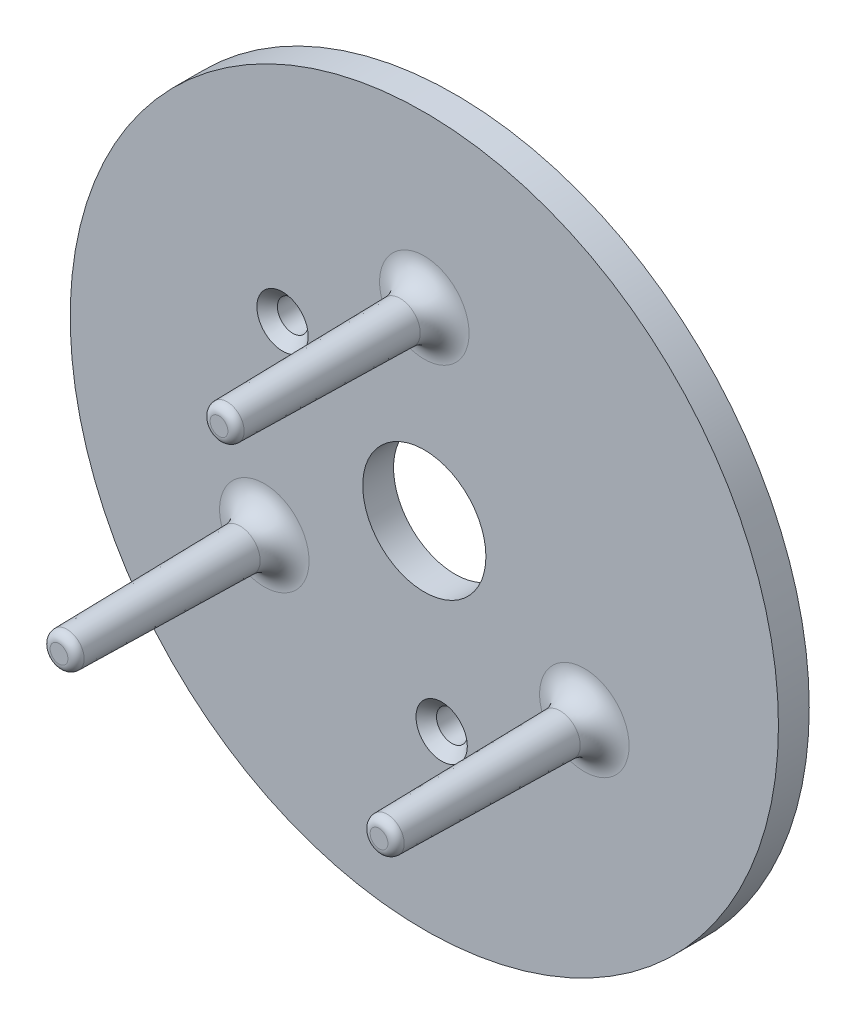
ISO-10303-21;
HEADER;
FILE_DESCRIPTION(('STEP AP214'),'2;1');
FILE_NAME('part.step','',(''),(''),'','','');
FILE_SCHEMA(('AUTOMOTIVE_DESIGN { 1 0 10303 214 1 1 1 1 }'));
ENDSEC;
DATA;
#1=APPLICATION_CONTEXT('core data for automotive mechanical design processes');
#2=APPLICATION_PROTOCOL_DEFINITION('international standard','automotive_design',2000,#1);
#3=PRODUCT_CONTEXT('',#1,'mechanical');
#4=PRODUCT('Part','Part','',(#3));
#5=PRODUCT_RELATED_PRODUCT_CATEGORY('part','',(#4));
#6=PRODUCT_DEFINITION_FORMATION('','',#4);
#7=PRODUCT_DEFINITION_CONTEXT('part definition',#1,'design');
#8=PRODUCT_DEFINITION('design','',#6,#7);
#9=PRODUCT_DEFINITION_SHAPE('','',#8);
#10=(LENGTH_UNIT() NAMED_UNIT(*) SI_UNIT(.MILLI.,.METRE.));
#11=(NAMED_UNIT(*) PLANE_ANGLE_UNIT() SI_UNIT($,.RADIAN.));
#12=(NAMED_UNIT(*) SI_UNIT($,.STERADIAN.) SOLID_ANGLE_UNIT());
#13=UNCERTAINTY_MEASURE_WITH_UNIT(LENGTH_MEASURE(1.E-05),#10,'distance_accuracy_value','');
#14=(GEOMETRIC_REPRESENTATION_CONTEXT(3) GLOBAL_UNCERTAINTY_ASSIGNED_CONTEXT((#13)) GLOBAL_UNIT_ASSIGNED_CONTEXT((#10,
#11,#12)) REPRESENTATION_CONTEXT('',''));
#15=CARTESIAN_POINT('',(0.,0.,0.));
#16=DIRECTION('',(0.,0.,1.));
#17=DIRECTION('',(1.,0.,0.));
#18=AXIS2_PLACEMENT_3D('',#15,#16,#17);
#19=CARTESIAN_POINT('',(0.,0.,3.));
#20=DIRECTION('',(0.,0.,-1.));
#21=DIRECTION('',(-1.,0.,0.));
#22=AXIS2_PLACEMENT_3D('',#19,#20,#21);
#23=CYLINDRICAL_SURFACE('',#22,6.);
#24=CARTESIAN_POINT('',(0.,0.,3.));
#25=DIRECTION('',(0.,0.,1.));
#26=DIRECTION('',(1.,0.,0.));
#27=AXIS2_PLACEMENT_3D('',#24,#25,#26);
#28=CIRCLE('',#27,6.);
#29=CARTESIAN_POINT('',(6.,0.,3.));
#30=VERTEX_POINT('',#29);
#31=EDGE_CURVE('E102',#30,#30,#28,.T.);
#32=ORIENTED_EDGE('',*,*,#31,.T.);
#33=EDGE_LOOP('',(#32));
#34=FACE_BOUND('',#33,.T.);
#35=CARTESIAN_POINT('',(0.,0.,0.));
#36=DIRECTION('',(0.,0.,1.));
#37=DIRECTION('',(1.,0.,0.));
#38=AXIS2_PLACEMENT_3D('',#35,#36,#37);
#39=CIRCLE('',#38,6.);
#40=CARTESIAN_POINT('',(6.,0.,0.));
#41=VERTEX_POINT('',#40);
#42=EDGE_CURVE('E103',#41,#41,#39,.T.);
#43=ORIENTED_EDGE('',*,*,#42,.F.);
#44=EDGE_LOOP('',(#43));
#45=FACE_BOUND('',#44,.T.);
#46=ADVANCED_FACE('F41',(#34,#45),#23,.F.);
#47=CARTESIAN_POINT('',(0.,0.,3.));
#48=DIRECTION('',(0.,0.,-1.));
#49=DIRECTION('',(-1.,0.,0.));
#50=AXIS2_PLACEMENT_3D('',#47,#48,#49);
#51=CYLINDRICAL_SURFACE('',#50,34.5);
#52=CARTESIAN_POINT('',(0.,0.,3.));
#53=DIRECTION('',(0.,0.,1.));
#54=DIRECTION('',(1.,0.,0.));
#55=AXIS2_PLACEMENT_3D('',#52,#53,#54);
#56=CIRCLE('',#55,34.5);
#57=CARTESIAN_POINT('',(34.5,0.,3.));
#58=VERTEX_POINT('',#57);
#59=EDGE_CURVE('E98',#58,#58,#56,.T.);
#60=ORIENTED_EDGE('',*,*,#59,.F.);
#61=EDGE_LOOP('',(#60));
#62=FACE_BOUND('',#61,.T.);
#63=CARTESIAN_POINT('',(0.,0.,0.));
#64=DIRECTION('',(0.,0.,1.));
#65=DIRECTION('',(1.,0.,0.));
#66=AXIS2_PLACEMENT_3D('',#63,#64,#65);
#67=CIRCLE('',#66,34.5);
#68=CARTESIAN_POINT('',(34.5,0.,0.));
#69=VERTEX_POINT('',#68);
#70=EDGE_CURVE('E99',#69,#69,#67,.T.);
#71=ORIENTED_EDGE('',*,*,#70,.T.);
#72=EDGE_LOOP('',(#71));
#73=FACE_BOUND('',#72,.T.);
#74=ADVANCED_FACE('F131',(#62,#73),#51,.T.);
#75=CARTESIAN_POINT('',(0.,0.,3.));
#76=DIRECTION('',(0.,0.,1.));
#77=DIRECTION('',(1.,0.,0.));
#78=AXIS2_PLACEMENT_3D('',#75,#76,#77);
#79=PLANE('',#78);
#80=CARTESIAN_POINT('',(1.68782217350877,-16.9233937586588,3.));
#81=DIRECTION('',(0.,0.,1.));
#82=DIRECTION('',(1.,0.,0.));
#83=AXIS2_PLACEMENT_3D('',#80,#81,#82);
#84=CIRCLE('',#83,2.50000000000006);
#85=CARTESIAN_POINT('',(4.18782217350883,-16.9233937586588,3.));
#86=VERTEX_POINT('',#85);
#87=EDGE_CURVE('E49',#86,#86,#84,.F.);
#88=ORIENTED_EDGE('',*,*,#87,.T.);
#89=EDGE_LOOP('',(#88));
#90=FACE_BOUND('',#89,.T.);
#91=CARTESIAN_POINT('',(-13.812177826491,9.92339375865892,3.));
#92=DIRECTION('',(0.,0.,1.));
#93=DIRECTION('',(1.,0.,0.));
#94=AXIS2_PLACEMENT_3D('',#91,#92,#93);
#95=CIRCLE('',#94,2.50000000000005);
#96=CARTESIAN_POINT('',(-11.3121778264909,9.92339375865892,3.));
#97=VERTEX_POINT('',#96);
#98=EDGE_CURVE('E53',#97,#97,#95,.F.);
#99=ORIENTED_EDGE('',*,*,#98,.T.);
#100=EDGE_LOOP('',(#99));
#101=FACE_BOUND('',#100,.T.);
#102=CARTESIAN_POINT('',(-15.58845726812,-8.99999999999985,3.));
#103=DIRECTION('',(0.,0.,1.));
#104=DIRECTION('',(1.,0.,0.));
#105=AXIS2_PLACEMENT_3D('',#102,#103,#104);
#106=CIRCLE('',#105,4.35847343147765);
#107=CARTESIAN_POINT('',(-11.2299838366423,-8.99999999999985,3.));
#108=VERTEX_POINT('',#107);
#109=EDGE_CURVE('E62',#108,#108,#106,.F.);
#110=ORIENTED_EDGE('',*,*,#109,.T.);
#111=EDGE_LOOP('',(#110));
#112=FACE_BOUND('',#111,.T.);
#113=CARTESIAN_POINT('',(15.5884572681199,-9.00000000000007,3.));
#114=DIRECTION('',(0.,0.,1.));
#115=DIRECTION('',(1.,0.,0.));
#116=AXIS2_PLACEMENT_3D('',#113,#114,#115);
#117=CIRCLE('',#116,4.35847343147765);
#118=CARTESIAN_POINT('',(19.9469306995975,-9.00000000000007,3.));
#119=VERTEX_POINT('',#118);
#120=EDGE_CURVE('E68',#119,#119,#117,.F.);
#121=ORIENTED_EDGE('',*,*,#120,.T.);
#122=EDGE_LOOP('',(#121));
#123=FACE_BOUND('',#122,.T.);
#124=CARTESIAN_POINT('',(0.,18.,3.));
#125=DIRECTION('',(0.,0.,1.));
#126=DIRECTION('',(1.,0.,0.));
#127=AXIS2_PLACEMENT_3D('',#124,#125,#126);
#128=CIRCLE('',#127,4.35847343147765);
#129=CARTESIAN_POINT('',(4.35847343147765,18.,3.));
#130=VERTEX_POINT('',#129);
#131=EDGE_CURVE('E86',#130,#130,#128,.F.);
#132=ORIENTED_EDGE('',*,*,#131,.T.);
#133=EDGE_LOOP('',(#132));
#134=FACE_BOUND('',#133,.T.);
#135=ORIENTED_EDGE('',*,*,#31,.F.);
#136=EDGE_LOOP('',(#135));
#137=FACE_BOUND('',#136,.T.);
#138=ORIENTED_EDGE('',*,*,#59,.T.);
#139=EDGE_LOOP('',(#138));
#140=FACE_BOUND('',#139,.T.);
#141=ADVANCED_FACE('F123',(#90,#101,#112,#123,#134,#137,#140),#79,.T.);
#142=CARTESIAN_POINT('',(0.,0.,0.));
#143=DIRECTION('',(0.,0.,1.));
#144=DIRECTION('',(1.,0.,0.));
#145=AXIS2_PLACEMENT_3D('',#142,#143,#144);
#146=PLANE('',#145);
#147=CARTESIAN_POINT('',(1.68782217350877,-16.9233937586588,0.));
#148=DIRECTION('',(0.,0.,1.));
#149=DIRECTION('',(1.,0.,0.));
#150=AXIS2_PLACEMENT_3D('',#147,#148,#149);
#151=CIRCLE('',#150,1.5);
#152=CARTESIAN_POINT('',(3.18782217350877,-16.9233937586588,0.));
#153=VERTEX_POINT('',#152);
#154=EDGE_CURVE('E106',#153,#153,#151,.F.);
#155=ORIENTED_EDGE('',*,*,#154,.F.);
#156=EDGE_LOOP('',(#155));
#157=FACE_BOUND('',#156,.T.);
#158=CARTESIAN_POINT('',(-13.812177826491,9.92339375865892,0.));
#159=DIRECTION('',(0.,0.,1.));
#160=DIRECTION('',(1.,0.,0.));
#161=AXIS2_PLACEMENT_3D('',#158,#159,#160);
#162=CIRCLE('',#161,1.5);
#163=CARTESIAN_POINT('',(-12.312177826491,9.92339375865892,0.));
#164=VERTEX_POINT('',#163);
#165=EDGE_CURVE('E111',#164,#164,#162,.F.);
#166=ORIENTED_EDGE('',*,*,#165,.F.);
#167=EDGE_LOOP('',(#166));
#168=FACE_BOUND('',#167,.T.);
#169=ORIENTED_EDGE('',*,*,#42,.T.);
#170=EDGE_LOOP('',(#169));
#171=FACE_BOUND('',#170,.T.);
#172=ORIENTED_EDGE('',*,*,#70,.F.);
#173=EDGE_LOOP('',(#172));
#174=FACE_BOUND('',#173,.T.);
#175=ADVANCED_FACE('F119',(#157,#168,#171,#174),#146,.F.);
#176=CARTESIAN_POINT('',(0.,18.,3.));
#177=DIRECTION('',(0.,0.,-1.));
#178=DIRECTION('',(1.,0.,0.));
#179=AXIS2_PLACEMENT_3D('',#176,#177,#178);
#180=CONICAL_SURFACE('',#179,2.,0.0174532925199433);
#181=CARTESIAN_POINT('',(0.,18.,5.35811422455051));
#182=DIRECTION('',(0.,0.,1.));
#183=DIRECTION('',(1.,0.,0.));
#184=AXIS2_PLACEMENT_3D('',#181,#182,#183);
#185=CIRCLE('',#184,1.95883896310232);
#186=CARTESIAN_POINT('',(1.95883896310232,18.,5.35811422455051));
#187=VERTEX_POINT('',#186);
#188=EDGE_CURVE('E89',#187,#187,#185,.T.);
#189=ORIENTED_EDGE('',*,*,#188,.T.);
#190=EDGE_LOOP('',(#189));
#191=FACE_BOUND('',#190,.T.);
#192=CARTESIAN_POINT('',(0.,18.,22.2139619251498));
#193=DIRECTION('',(0.,0.,-1.));
#194=DIRECTION('',(-1.,0.,0.));
#195=AXIS2_PLACEMENT_3D('',#192,#193,#194);
#196=CIRCLE('',#195,1.66461904706821);
#197=CARTESIAN_POINT('',(-1.66461904706821,18.,22.2139619251498));
#198=VERTEX_POINT('',#197);
#199=EDGE_CURVE('E92',#198,#198,#196,.T.);
#200=ORIENTED_EDGE('',*,*,#199,.T.);
#201=EDGE_LOOP('',(#200));
#202=FACE_BOUND('',#201,.T.);
#203=ADVANCED_FACE('F122',(#191,#202),#180,.T.);
#204=CARTESIAN_POINT('',(0.,18.,23.));
#205=DIRECTION('',(0.,0.,1.));
#206=DIRECTION('',(1.,0.,0.));
#207=AXIS2_PLACEMENT_3D('',#204,#205,#206);
#208=PLANE('',#207);
#209=CARTESIAN_POINT('',(0.,18.,23.));
#210=DIRECTION('',(0.,0.,1.));
#211=DIRECTION('',(1.,0.,0.));
#212=AXIS2_PLACEMENT_3D('',#209,#210,#211);
#213=CIRCLE('',#212,0.864740890943095);
#214=CARTESIAN_POINT('',(0.864740890943095,18.,23.));
#215=VERTEX_POINT('',#214);
#216=EDGE_CURVE('E95',#215,#215,#213,.T.);
#217=ORIENTED_EDGE('',*,*,#216,.T.);
#218=EDGE_LOOP('',(#217));
#219=FACE_BOUND('',#218,.T.);
#220=ADVANCED_FACE('F149',(#219),#208,.T.);
#221=CARTESIAN_POINT('',(0.,18.,22.2));
#222=DIRECTION('',(0.,0.,1.));
#223=DIRECTION('',(1.,0.,0.));
#224=AXIS2_PLACEMENT_3D('',#221,#222,#223);
#225=TOROIDAL_SURFACE('',#224,0.864740890943095,0.8);
#226=ORIENTED_EDGE('',*,*,#199,.F.);
#227=EDGE_LOOP('',(#226));
#228=FACE_BOUND('',#227,.T.);
#229=ORIENTED_EDGE('',*,*,#216,.F.);
#230=EDGE_LOOP('',(#229));
#231=FACE_BOUND('',#230,.T.);
#232=ADVANCED_FACE('F145',(#228,#231),#225,.T.);
#233=CARTESIAN_POINT('',(0.,18.,5.4));
#234=DIRECTION('',(0.,0.,1.));
#235=DIRECTION('',(1.,0.,0.));
#236=AXIS2_PLACEMENT_3D('',#233,#234,#235);
#237=TOROIDAL_SURFACE('',#236,4.35847343147765,2.4);
#238=ORIENTED_EDGE('',*,*,#131,.F.);
#239=EDGE_LOOP('',(#238));
#240=FACE_BOUND('',#239,.T.);
#241=ORIENTED_EDGE('',*,*,#188,.F.);
#242=EDGE_LOOP('',(#241));
#243=FACE_BOUND('',#242,.T.);
#244=ADVANCED_FACE('F148',(#240,#243),#237,.F.);
#245=CARTESIAN_POINT('',(-15.58845726812,-8.99999999999985,3.));
#246=DIRECTION('',(0.,0.,-1.));
#247=DIRECTION('',(1.,0.,0.));
#248=AXIS2_PLACEMENT_3D('',#245,#246,#247);
#249=CONICAL_SURFACE('',#248,2.,0.0174532925199433);
#250=CARTESIAN_POINT('',(-15.58845726812,-8.99999999999985,5.35811422455051));
#251=DIRECTION('',(0.,0.,1.));
#252=DIRECTION('',(1.,0.,0.));
#253=AXIS2_PLACEMENT_3D('',#250,#251,#252);
#254=CIRCLE('',#253,1.95883896310232);
#255=CARTESIAN_POINT('',(-13.6296183050177,-8.99999999999985,5.35811422455051));
#256=VERTEX_POINT('',#255);
#257=EDGE_CURVE('E65',#256,#256,#254,.T.);
#258=ORIENTED_EDGE('',*,*,#257,.T.);
#259=EDGE_LOOP('',(#258));
#260=FACE_BOUND('',#259,.T.);
#261=CARTESIAN_POINT('',(-15.58845726812,-8.99999999999985,22.2139619251498));
#262=DIRECTION('',(0.,0.,-1.));
#263=DIRECTION('',(-1.,0.,0.));
#264=AXIS2_PLACEMENT_3D('',#261,#262,#263);
#265=CIRCLE('',#264,1.66461904706821);
#266=CARTESIAN_POINT('',(-17.2530763151882,-8.99999999999985,22.2139619251498));
#267=VERTEX_POINT('',#266);
#268=EDGE_CURVE('E74',#267,#267,#265,.T.);
#269=ORIENTED_EDGE('',*,*,#268,.T.);
#270=EDGE_LOOP('',(#269));
#271=FACE_BOUND('',#270,.T.);
#272=ADVANCED_FACE('F153',(#260,#271),#249,.T.);
#273=CARTESIAN_POINT('',(-15.58845726812,-8.99999999999985,23.));
#274=DIRECTION('',(0.,0.,1.));
#275=DIRECTION('',(1.,0.,0.));
#276=AXIS2_PLACEMENT_3D('',#273,#274,#275);
#277=PLANE('',#276);
#278=CARTESIAN_POINT('',(-15.58845726812,-8.99999999999985,23.));
#279=DIRECTION('',(0.,0.,1.));
#280=DIRECTION('',(1.,0.,0.));
#281=AXIS2_PLACEMENT_3D('',#278,#279,#280);
#282=CIRCLE('',#281,0.864740890943095);
#283=CARTESIAN_POINT('',(-14.7237163771769,-8.99999999999985,23.));
#284=VERTEX_POINT('',#283);
#285=EDGE_CURVE('E77',#284,#284,#282,.T.);
#286=ORIENTED_EDGE('',*,*,#285,.T.);
#287=EDGE_LOOP('',(#286));
#288=FACE_BOUND('',#287,.T.);
#289=ADVANCED_FACE('F198',(#288),#277,.T.);
#290=CARTESIAN_POINT('',(15.5884572681199,-9.00000000000007,3.));
#291=DIRECTION('',(0.,0.,-1.));
#292=DIRECTION('',(1.,0.,0.));
#293=AXIS2_PLACEMENT_3D('',#290,#291,#292);
#294=CONICAL_SURFACE('',#293,2.,0.0174532925199433);
#295=CARTESIAN_POINT('',(15.5884572681199,-9.00000000000007,5.35811422455051));
#296=DIRECTION('',(0.,0.,1.));
#297=DIRECTION('',(1.,0.,0.));
#298=AXIS2_PLACEMENT_3D('',#295,#296,#297);
#299=CIRCLE('',#298,1.95883896310232);
#300=CARTESIAN_POINT('',(17.5472962312222,-9.00000000000007,5.35811422455051));
#301=VERTEX_POINT('',#300);
#302=EDGE_CURVE('E71',#301,#301,#299,.T.);
#303=ORIENTED_EDGE('',*,*,#302,.T.);
#304=EDGE_LOOP('',(#303));
#305=FACE_BOUND('',#304,.T.);
#306=CARTESIAN_POINT('',(15.5884572681199,-9.00000000000007,22.2139619251498));
#307=DIRECTION('',(0.,0.,-1.));
#308=DIRECTION('',(-1.,0.,0.));
#309=AXIS2_PLACEMENT_3D('',#306,#307,#308);
#310=CIRCLE('',#309,1.66461904706821);
#311=CARTESIAN_POINT('',(13.9238382210516,-9.00000000000007,22.2139619251498));
#312=VERTEX_POINT('',#311);
#313=EDGE_CURVE('E80',#312,#312,#310,.T.);
#314=ORIENTED_EDGE('',*,*,#313,.T.);
#315=EDGE_LOOP('',(#314));
#316=FACE_BOUND('',#315,.T.);
#317=ADVANCED_FACE('F194',(#305,#316),#294,.T.);
#318=CARTESIAN_POINT('',(15.5884572681199,-9.00000000000007,23.));
#319=DIRECTION('',(0.,0.,1.));
#320=DIRECTION('',(1.,0.,0.));
#321=AXIS2_PLACEMENT_3D('',#318,#319,#320);
#322=PLANE('',#321);
#323=CARTESIAN_POINT('',(15.5884572681199,-9.00000000000007,23.));
#324=DIRECTION('',(0.,0.,1.));
#325=DIRECTION('',(1.,0.,0.));
#326=AXIS2_PLACEMENT_3D('',#323,#324,#325);
#327=CIRCLE('',#326,0.864740890943095);
#328=CARTESIAN_POINT('',(16.453198159063,-9.00000000000007,23.));
#329=VERTEX_POINT('',#328);
#330=EDGE_CURVE('E83',#329,#329,#327,.T.);
#331=ORIENTED_EDGE('',*,*,#330,.T.);
#332=EDGE_LOOP('',(#331));
#333=FACE_BOUND('',#332,.T.);
#334=ADVANCED_FACE('F159',(#333),#322,.T.);
#335=CARTESIAN_POINT('',(15.5884572681199,-9.00000000000007,22.2));
#336=DIRECTION('',(0.,0.,1.));
#337=DIRECTION('',(1.,0.,0.));
#338=AXIS2_PLACEMENT_3D('',#335,#336,#337);
#339=TOROIDAL_SURFACE('',#338,0.864740890943095,0.8);
#340=ORIENTED_EDGE('',*,*,#313,.F.);
#341=EDGE_LOOP('',(#340));
#342=FACE_BOUND('',#341,.T.);
#343=ORIENTED_EDGE('',*,*,#330,.F.);
#344=EDGE_LOOP('',(#343));
#345=FACE_BOUND('',#344,.T.);
#346=ADVANCED_FACE('F155',(#342,#345),#339,.T.);
#347=CARTESIAN_POINT('',(-15.58845726812,-8.99999999999985,22.2));
#348=DIRECTION('',(0.,0.,1.));
#349=DIRECTION('',(1.,0.,0.));
#350=AXIS2_PLACEMENT_3D('',#347,#348,#349);
#351=TOROIDAL_SURFACE('',#350,0.864740890943095,0.8);
#352=ORIENTED_EDGE('',*,*,#268,.F.);
#353=EDGE_LOOP('',(#352));
#354=FACE_BOUND('',#353,.T.);
#355=ORIENTED_EDGE('',*,*,#285,.F.);
#356=EDGE_LOOP('',(#355));
#357=FACE_BOUND('',#356,.T.);
#358=ADVANCED_FACE('F158',(#354,#357),#351,.T.);
#359=CARTESIAN_POINT('',(15.5884572681199,-9.00000000000007,5.4));
#360=DIRECTION('',(0.,0.,1.));
#361=DIRECTION('',(1.,0.,0.));
#362=AXIS2_PLACEMENT_3D('',#359,#360,#361);
#363=TOROIDAL_SURFACE('',#362,4.35847343147765,2.4);
#364=ORIENTED_EDGE('',*,*,#120,.F.);
#365=EDGE_LOOP('',(#364));
#366=FACE_BOUND('',#365,.T.);
#367=ORIENTED_EDGE('',*,*,#302,.F.);
#368=EDGE_LOOP('',(#367));
#369=FACE_BOUND('',#368,.T.);
#370=ADVANCED_FACE('F163',(#366,#369),#363,.F.);
#371=CARTESIAN_POINT('',(-15.58845726812,-8.99999999999985,5.4));
#372=DIRECTION('',(0.,0.,1.));
#373=DIRECTION('',(1.,0.,0.));
#374=AXIS2_PLACEMENT_3D('',#371,#372,#373);
#375=TOROIDAL_SURFACE('',#374,4.35847343147765,2.4);
#376=ORIENTED_EDGE('',*,*,#109,.F.);
#377=EDGE_LOOP('',(#376));
#378=FACE_BOUND('',#377,.T.);
#379=ORIENTED_EDGE('',*,*,#257,.F.);
#380=EDGE_LOOP('',(#379));
#381=FACE_BOUND('',#380,.T.);
#382=ADVANCED_FACE('F167',(#378,#381),#375,.F.);
#383=CARTESIAN_POINT('',(-13.812177826491,9.92339375865892,-0.00100000000000013));
#384=DIRECTION('',(0.,0.,1.));
#385=DIRECTION('',(1.,0.,0.));
#386=AXIS2_PLACEMENT_3D('',#383,#384,#385);
#387=CYLINDRICAL_SURFACE('',#386,1.5);
#388=CARTESIAN_POINT('',(-13.812177826491,9.92339375865892,1.99999999999995));
#389=DIRECTION('',(0.,0.,1.));
#390=DIRECTION('',(1.,0.,0.));
#391=AXIS2_PLACEMENT_3D('',#388,#389,#390);
#392=CIRCLE('',#391,1.5);
#393=CARTESIAN_POINT('',(-12.312177826491,9.92339375865892,1.99999999999995));
#394=VERTEX_POINT('',#393);
#395=EDGE_CURVE('E10',#394,#394,#392,.T.);
#396=CARTESIAN_POINT('',(-12.312177826491,9.92339375865892,1.99999999999995));
#397=CARTESIAN_POINT('',(-12.312177826491,9.92339375865892,1.97916666666662));
#398=CARTESIAN_POINT('',(-12.312177826491,9.92339375865892,1.95833333333328));
#399=CARTESIAN_POINT('',(-12.312177826491,9.92339375865892,1.91666666666662));
#400=CARTESIAN_POINT('',(-12.312177826491,9.92339375865892,1.89583333333328));
#401=CARTESIAN_POINT('',(-12.312177826491,9.92339375865892,1.85416666666662));
#402=CARTESIAN_POINT('',(-12.312177826491,9.92339375865892,1.83333333333329));
#403=CARTESIAN_POINT('',(-12.312177826491,9.92339375865892,1.79166666666662));
#404=CARTESIAN_POINT('',(-12.312177826491,9.92339375865892,1.77083333333329));
#405=CARTESIAN_POINT('',(-12.312177826491,9.92339375865892,1.72916666666662));
#406=CARTESIAN_POINT('',(-12.312177826491,9.92339375865892,1.70833333333329));
#407=CARTESIAN_POINT('',(-12.312177826491,9.92339375865892,1.66666666666662));
#408=CARTESIAN_POINT('',(-12.312177826491,9.92339375865892,1.64583333333329));
#409=CARTESIAN_POINT('',(-12.312177826491,9.92339375865892,1.60416666666663));
#410=CARTESIAN_POINT('',(-12.312177826491,9.92339375865892,1.58333333333329));
#411=CARTESIAN_POINT('',(-12.312177826491,9.92339375865892,1.54166666666663));
#412=CARTESIAN_POINT('',(-12.312177826491,9.92339375865892,1.52083333333329));
#413=CARTESIAN_POINT('',(-12.312177826491,9.92339375865892,1.47916666666663));
#414=CARTESIAN_POINT('',(-12.312177826491,9.92339375865892,1.4583333333333));
#415=CARTESIAN_POINT('',(-12.312177826491,9.92339375865892,1.41666666666663));
#416=CARTESIAN_POINT('',(-12.312177826491,9.92339375865892,1.3958333333333));
#417=CARTESIAN_POINT('',(-12.312177826491,9.92339375865892,1.35416666666663));
#418=CARTESIAN_POINT('',(-12.312177826491,9.92339375865892,1.3333333333333));
#419=CARTESIAN_POINT('',(-12.312177826491,9.92339375865892,1.29166666666663));
#420=CARTESIAN_POINT('',(-12.312177826491,9.92339375865892,1.2708333333333));
#421=CARTESIAN_POINT('',(-12.312177826491,9.92339375865892,1.22916666666664));
#422=CARTESIAN_POINT('',(-12.312177826491,9.92339375865892,1.2083333333333));
#423=CARTESIAN_POINT('',(-12.312177826491,9.92339375865892,1.16666666666664));
#424=CARTESIAN_POINT('',(-12.312177826491,9.92339375865892,1.1458333333333));
#425=CARTESIAN_POINT('',(-12.312177826491,9.92339375865892,1.10416666666664));
#426=CARTESIAN_POINT('',(-12.312177826491,9.92339375865892,1.08333333333331));
#427=CARTESIAN_POINT('',(-12.312177826491,9.92339375865892,1.04166666666664));
#428=CARTESIAN_POINT('',(-12.312177826491,9.92339375865892,1.02083333333331));
#429=CARTESIAN_POINT('',(-12.312177826491,9.92339375865892,0.979166666666641));
#430=CARTESIAN_POINT('',(-12.312177826491,9.92339375865892,0.958333333333309));
#431=CARTESIAN_POINT('',(-12.312177826491,9.92339375865892,0.916666666666643));
#432=CARTESIAN_POINT('',(-12.312177826491,9.92339375865892,0.89583333333331));
#433=CARTESIAN_POINT('',(-12.312177826491,9.92339375865892,0.854166666666645));
#434=CARTESIAN_POINT('',(-12.312177826491,9.92339375865892,0.833333333333312));
#435=CARTESIAN_POINT('',(-12.312177826491,9.92339375865892,0.791666666666646));
#436=CARTESIAN_POINT('',(-12.312177826491,9.92339375865892,0.770833333333313));
#437=CARTESIAN_POINT('',(-12.312177826491,9.92339375865892,0.729166666666648));
#438=CARTESIAN_POINT('',(-12.312177826491,9.92339375865892,0.708333333333315));
#439=CARTESIAN_POINT('',(-12.312177826491,9.92339375865892,0.66666666666665));
#440=CARTESIAN_POINT('',(-12.312177826491,9.92339375865892,0.645833333333317));
#441=CARTESIAN_POINT('',(-12.312177826491,9.92339375865892,0.604166666666651));
#442=CARTESIAN_POINT('',(-12.312177826491,9.92339375865892,0.583333333333318));
#443=CARTESIAN_POINT('',(-12.312177826491,9.92339375865892,0.541666666666653));
#444=CARTESIAN_POINT('',(-12.312177826491,9.92339375865892,0.52083333333332));
#445=CARTESIAN_POINT('',(-12.312177826491,9.92339375865892,0.479166666666654));
#446=CARTESIAN_POINT('',(-12.312177826491,9.92339375865892,0.458333333333322));
#447=CARTESIAN_POINT('',(-12.312177826491,9.92339375865892,0.416666666666656));
#448=CARTESIAN_POINT('',(-12.312177826491,9.92339375865892,0.395833333333323));
#449=CARTESIAN_POINT('',(-12.312177826491,9.92339375865892,0.354166666666658));
#450=CARTESIAN_POINT('',(-12.312177826491,9.92339375865892,0.333333333333325));
#451=CARTESIAN_POINT('',(-12.312177826491,9.92339375865892,0.291666666666659));
#452=CARTESIAN_POINT('',(-12.312177826491,9.92339375865892,0.270833333333326));
#453=CARTESIAN_POINT('',(-12.312177826491,9.92339375865892,0.229166666666661));
#454=CARTESIAN_POINT('',(-12.312177826491,9.92339375865892,0.208333333333328));
#455=CARTESIAN_POINT('',(-12.312177826491,9.92339375865892,0.166666666666662));
#456=CARTESIAN_POINT('',(-12.312177826491,9.92339375865892,0.14583333333333));
#457=CARTESIAN_POINT('',(-12.312177826491,9.92339375865892,0.104166666666664));
#458=CARTESIAN_POINT('',(-12.312177826491,9.92339375865892,0.0833333333333311));
#459=CARTESIAN_POINT('',(-12.312177826491,9.92339375865892,0.0416666666666655));
#460=CARTESIAN_POINT('',(-12.312177826491,9.92339375865892,0.0208333333333328));
#461=CARTESIAN_POINT('',(-12.312177826491,9.92339375865892,0.));
#462=B_SPLINE_CURVE_WITH_KNOTS('',3,(#396,#397,#398,#399,#400,#401,#402,#403,#404,#405,#406,
#407,#408,#409,#410,#411,#412,#413,#414,#415,#416,#417,#418,#419,#420,#421,#422,#423,#424,#425,
#426,#427,#428,#429,#430,#431,#432,#433,#434,#435,#436,#437,#438,#439,#440,#441,#442,#443,#444,
#445,#446,#447,#448,#449,#450,#451,#452,#453,#454,#455,#456,#457,#458,#459,#460,#461),
.UNSPECIFIED.,.F.,.F.,(4,2,2,2,2,2,2,2,2,2,2,2,2,2,2,2,2,2,2,2,2,2,2,2,2,2,2,2,2,2,2,2,4),(0.,
0.0624999999999981,0.124999999999997,0.187499999999995,0.249999999999994,0.312499999999992,
0.37499999999999,0.437499999999988,0.499999999999987,0.562499999999986,0.624999999999984,
0.687499999999982,0.74999999999998,0.812499999999979,0.874999999999977,0.937499999999976,
0.999999999999974,1.06249999999997,1.12499999999997,1.18749999999997,1.24999999999997,
1.31249999999997,1.37499999999996,1.43749999999996,1.49999999999996,1.56249999999996,
1.62499999999996,1.68749999999996,1.74999999999995,1.81249999999995,1.87499999999995,
1.93749999999995,1.99999999999995),.UNSPECIFIED.);
#463=EDGE_CURVE('BSEAM170',#394,#164,#462,.T.);
#464=ORIENTED_EDGE('',*,*,#395,.T.);
#465=ORIENTED_EDGE('',*,*,#165,.T.);
#466=ORIENTED_EDGE('',*,*,#463,.T.);
#467=ORIENTED_EDGE('',*,*,#463,.F.);
#468=EDGE_LOOP('',(#464,#466,#465,#467));
#469=FACE_BOUND('',#468,.T.);
#470=ADVANCED_FACE('F170',(#469),#387,.F.);
#471=CARTESIAN_POINT('',(1.68782217350877,-16.9233937586588,-0.00100000000000013));
#472=DIRECTION('',(0.,0.,1.));
#473=DIRECTION('',(1.,0.,0.));
#474=AXIS2_PLACEMENT_3D('',#471,#472,#473);
#475=CYLINDRICAL_SURFACE('',#474,1.5);
#476=CARTESIAN_POINT('',(1.68782217350877,-16.9233937586588,1.99999999999995));
#477=DIRECTION('',(0.,0.,1.));
#478=DIRECTION('',(1.,0.,0.));
#479=AXIS2_PLACEMENT_3D('',#476,#477,#478);
#480=CIRCLE('',#479,1.5);
#481=CARTESIAN_POINT('',(3.18782217350877,-16.9233937586588,1.99999999999995));
#482=VERTEX_POINT('',#481);
#483=EDGE_CURVE('E57',#482,#482,#480,.T.);
#484=CARTESIAN_POINT('',(3.18782217350877,-16.9233937586588,1.99999999999995));
#485=CARTESIAN_POINT('',(3.18782217350877,-16.9233937586588,1.97916666666662));
#486=CARTESIAN_POINT('',(3.18782217350877,-16.9233937586588,1.95833333333329));
#487=CARTESIAN_POINT('',(3.18782217350877,-16.9233937586588,1.91666666666662));
#488=CARTESIAN_POINT('',(3.18782217350877,-16.9233937586588,1.89583333333329));
#489=CARTESIAN_POINT('',(3.18782217350877,-16.9233937586588,1.85416666666662));
#490=CARTESIAN_POINT('',(3.18782217350877,-16.9233937586588,1.83333333333329));
#491=CARTESIAN_POINT('',(3.18782217350877,-16.9233937586588,1.79166666666662));
#492=CARTESIAN_POINT('',(3.18782217350877,-16.9233937586588,1.77083333333329));
#493=CARTESIAN_POINT('',(3.18782217350877,-16.9233937586588,1.72916666666663));
#494=CARTESIAN_POINT('',(3.18782217350877,-16.9233937586588,1.70833333333329));
#495=CARTESIAN_POINT('',(3.18782217350877,-16.9233937586588,1.66666666666663));
#496=CARTESIAN_POINT('',(3.18782217350877,-16.9233937586588,1.64583333333329));
#497=CARTESIAN_POINT('',(3.18782217350877,-16.9233937586588,1.60416666666663));
#498=CARTESIAN_POINT('',(3.18782217350877,-16.9233937586588,1.5833333333333));
#499=CARTESIAN_POINT('',(3.18782217350877,-16.9233937586588,1.54166666666663));
#500=CARTESIAN_POINT('',(3.18782217350877,-16.9233937586588,1.5208333333333));
#501=CARTESIAN_POINT('',(3.18782217350877,-16.9233937586588,1.47916666666663));
#502=CARTESIAN_POINT('',(3.18782217350877,-16.9233937586588,1.4583333333333));
#503=CARTESIAN_POINT('',(3.18782217350877,-16.9233937586588,1.41666666666663));
#504=CARTESIAN_POINT('',(3.18782217350877,-16.9233937586588,1.3958333333333));
#505=CARTESIAN_POINT('',(3.18782217350877,-16.9233937586588,1.35416666666663));
#506=CARTESIAN_POINT('',(3.18782217350877,-16.9233937586588,1.3333333333333));
#507=CARTESIAN_POINT('',(3.18782217350877,-16.9233937586588,1.29166666666664));
#508=CARTESIAN_POINT('',(3.18782217350877,-16.9233937586588,1.2708333333333));
#509=CARTESIAN_POINT('',(3.18782217350877,-16.9233937586588,1.22916666666664));
#510=CARTESIAN_POINT('',(3.18782217350877,-16.9233937586588,1.2083333333333));
#511=CARTESIAN_POINT('',(3.18782217350877,-16.9233937586588,1.16666666666664));
#512=CARTESIAN_POINT('',(3.18782217350877,-16.9233937586588,1.14583333333331));
#513=CARTESIAN_POINT('',(3.18782217350877,-16.9233937586588,1.10416666666664));
#514=CARTESIAN_POINT('',(3.18782217350877,-16.9233937586588,1.08333333333331));
#515=CARTESIAN_POINT('',(3.18782217350877,-16.9233937586588,1.04166666666664));
#516=CARTESIAN_POINT('',(3.18782217350877,-16.9233937586588,1.02083333333331));
#517=CARTESIAN_POINT('',(3.18782217350877,-16.9233937586588,0.979166666666644));
#518=CARTESIAN_POINT('',(3.18782217350877,-16.9233937586588,0.958333333333311));
#519=CARTESIAN_POINT('',(3.18782217350877,-16.9233937586588,0.916666666666645));
#520=CARTESIAN_POINT('',(3.18782217350877,-16.9233937586588,0.895833333333312));
#521=CARTESIAN_POINT('',(3.18782217350877,-16.9233937586588,0.854166666666647));
#522=CARTESIAN_POINT('',(3.18782217350877,-16.9233937586588,0.833333333333314));
#523=CARTESIAN_POINT('',(3.18782217350877,-16.9233937586588,0.791666666666648));
#524=CARTESIAN_POINT('',(3.18782217350877,-16.9233937586588,0.770833333333315));
#525=CARTESIAN_POINT('',(3.18782217350877,-16.9233937586588,0.729166666666649));
#526=CARTESIAN_POINT('',(3.18782217350877,-16.9233937586588,0.708333333333317));
#527=CARTESIAN_POINT('',(3.18782217350877,-16.9233937586588,0.666666666666651));
#528=CARTESIAN_POINT('',(3.18782217350877,-16.9233937586588,0.645833333333318));
#529=CARTESIAN_POINT('',(3.18782217350877,-16.9233937586588,0.604166666666652));
#530=CARTESIAN_POINT('',(3.18782217350877,-16.9233937586588,0.58333333333332));
#531=CARTESIAN_POINT('',(3.18782217350877,-16.9233937586588,0.541666666666654));
#532=CARTESIAN_POINT('',(3.18782217350877,-16.9233937586588,0.520833333333321));
#533=CARTESIAN_POINT('',(3.18782217350877,-16.9233937586588,0.479166666666655));
#534=CARTESIAN_POINT('',(3.18782217350877,-16.9233937586588,0.458333333333323));
#535=CARTESIAN_POINT('',(3.18782217350877,-16.9233937586588,0.416666666666657));
#536=CARTESIAN_POINT('',(3.18782217350877,-16.9233937586588,0.395833333333324));
#537=CARTESIAN_POINT('',(3.18782217350877,-16.9233937586588,0.354166666666658));
#538=CARTESIAN_POINT('',(3.18782217350877,-16.9233937586588,0.333333333333325));
#539=CARTESIAN_POINT('',(3.18782217350877,-16.9233937586588,0.29166666666666));
#540=CARTESIAN_POINT('',(3.18782217350877,-16.9233937586588,0.270833333333327));
#541=CARTESIAN_POINT('',(3.18782217350877,-16.9233937586588,0.229166666666661));
#542=CARTESIAN_POINT('',(3.18782217350877,-16.9233937586588,0.208333333333328));
#543=CARTESIAN_POINT('',(3.18782217350877,-16.9233937586588,0.166666666666663));
#544=CARTESIAN_POINT('',(3.18782217350877,-16.9233937586588,0.14583333333333));
#545=CARTESIAN_POINT('',(3.18782217350877,-16.9233937586588,0.104166666666664));
#546=CARTESIAN_POINT('',(3.18782217350877,-16.9233937586588,0.0833333333333314));
#547=CARTESIAN_POINT('',(3.18782217350877,-16.9233937586588,0.0416666666666657));
#548=CARTESIAN_POINT('',(3.18782217350877,-16.9233937586588,0.0208333333333329));
#549=CARTESIAN_POINT('',(3.18782217350877,-16.9233937586588,0.));
#550=B_SPLINE_CURVE_WITH_KNOTS('',3,(#484,#485,#486,#487,#488,#489,#490,#491,#492,#493,#494,
#495,#496,#497,#498,#499,#500,#501,#502,#503,#504,#505,#506,#507,#508,#509,#510,#511,#512,#513,
#514,#515,#516,#517,#518,#519,#520,#521,#522,#523,#524,#525,#526,#527,#528,#529,#530,#531,#532,
#533,#534,#535,#536,#537,#538,#539,#540,#541,#542,#543,#544,#545,#546,#547,#548,#549),
.UNSPECIFIED.,.F.,.F.,(4,2,2,2,2,2,2,2,2,2,2,2,2,2,2,2,2,2,2,2,2,2,2,2,2,2,2,2,2,2,2,2,4),(0.,
0.0624999999999983,0.124999999999997,0.187499999999995,0.249999999999994,0.312499999999992,
0.374999999999991,0.43749999999999,0.499999999999988,0.562499999999987,0.624999999999985,
0.687499999999984,0.749999999999982,0.812499999999981,0.874999999999979,0.937499999999978,
0.999999999999976,1.06249999999997,1.12499999999997,1.18749999999997,1.24999999999997,
1.31249999999997,1.37499999999997,1.43749999999997,1.49999999999996,1.56249999999996,
1.62499999999996,1.68749999999996,1.74999999999996,1.81249999999996,1.87499999999996,
1.93749999999995,1.99999999999995),.UNSPECIFIED.);
#551=EDGE_CURVE('BSEAM117',#482,#153,#550,.T.);
#552=ORIENTED_EDGE('',*,*,#483,.T.);
#553=ORIENTED_EDGE('',*,*,#154,.T.);
#554=ORIENTED_EDGE('',*,*,#551,.T.);
#555=ORIENTED_EDGE('',*,*,#551,.F.);
#556=EDGE_LOOP('',(#552,#554,#553,#555));
#557=FACE_BOUND('',#556,.T.);
#558=ADVANCED_FACE('F117',(#557),#475,.F.);
#559=CARTESIAN_POINT('',(1.68782217350877,-16.9233937586588,1.99999999999995));
#560=DIRECTION('',(0.,0.,1.));
#561=DIRECTION('',(1.,0.,0.));
#562=AXIS2_PLACEMENT_3D('',#559,#560,#561);
#563=CONICAL_SURFACE('',#562,1.5,0.785398163397453);
#564=ORIENTED_EDGE('',*,*,#87,.F.);
#565=EDGE_LOOP('',(#564));
#566=FACE_BOUND('',#565,.T.);
#567=ORIENTED_EDGE('',*,*,#483,.F.);
#568=EDGE_LOOP('',(#567));
#569=FACE_BOUND('',#568,.T.);
#570=ADVANCED_FACE('F173',(#566,#569),#563,.F.);
#571=CARTESIAN_POINT('',(-13.812177826491,9.92339375865892,1.99999999999995));
#572=DIRECTION('',(0.,0.,1.));
#573=DIRECTION('',(1.,0.,0.));
#574=AXIS2_PLACEMENT_3D('',#571,#572,#573);
#575=CONICAL_SURFACE('',#574,1.5,0.785398163397446);
#576=ORIENTED_EDGE('',*,*,#98,.F.);
#577=EDGE_LOOP('',(#576));
#578=FACE_BOUND('',#577,.T.);
#579=ORIENTED_EDGE('',*,*,#395,.F.);
#580=EDGE_LOOP('',(#579));
#581=FACE_BOUND('',#580,.T.);
#582=ADVANCED_FACE('F44',(#578,#581),#575,.F.);
#583=CLOSED_SHELL('',(#46,#74,#141,#175,#203,#220,#232,#244,#272,#289,#317,#334,#346,#358,#370,
#382,#470,#558,#570,#582));
#584=MANIFOLD_SOLID_BREP('B2',#583);
#585=ADVANCED_BREP_SHAPE_REPRESENTATION('',(#18,#584),#14);
#586=SHAPE_DEFINITION_REPRESENTATION(#9,#585);
ENDSEC;
END-ISO-10303-21;
